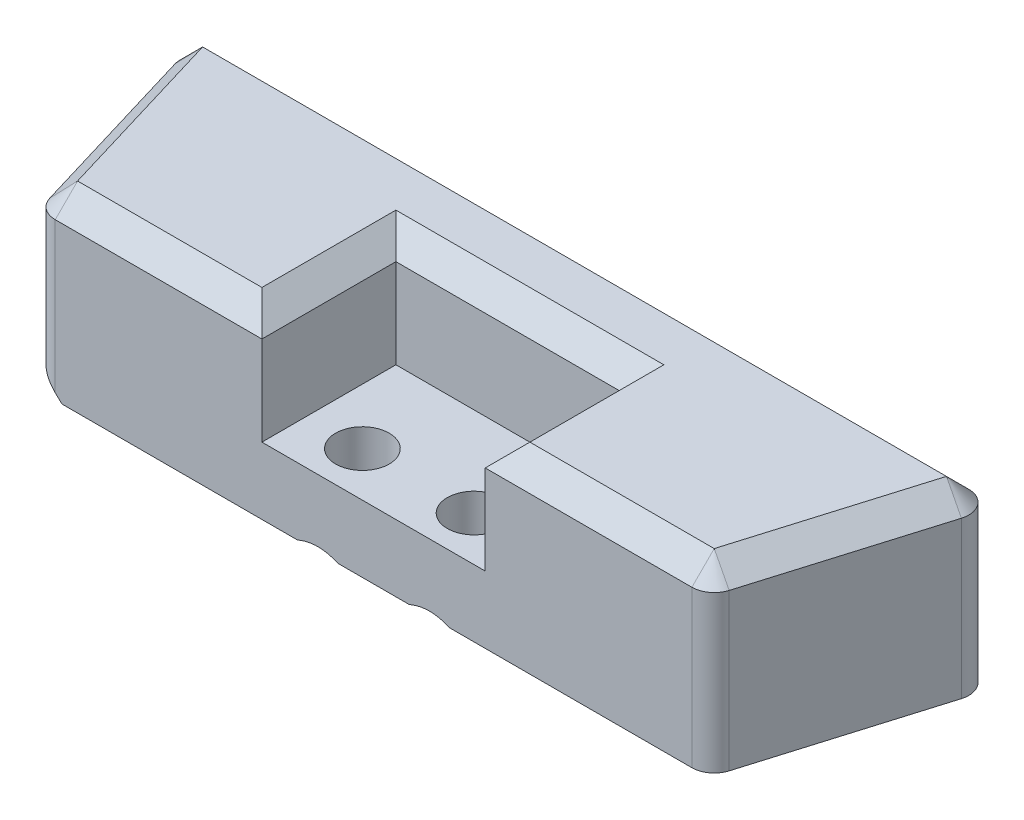
ISO-10303-21;
HEADER;
FILE_DESCRIPTION(('STEP AP214'),'2;1');
FILE_NAME('part.step','',(''),(''),'','','');
FILE_SCHEMA(('AUTOMOTIVE_DESIGN { 1 0 10303 214 1 1 1 1 }'));
ENDSEC;
DATA;
#1=APPLICATION_CONTEXT('core data for automotive mechanical design processes');
#2=APPLICATION_PROTOCOL_DEFINITION('international standard','automotive_design',2000,#1);
#3=PRODUCT_CONTEXT('',#1,'mechanical');
#4=PRODUCT('Part','Part','',(#3));
#5=PRODUCT_RELATED_PRODUCT_CATEGORY('part','',(#4));
#6=PRODUCT_DEFINITION_FORMATION('','',#4);
#7=PRODUCT_DEFINITION_CONTEXT('part definition',#1,'design');
#8=PRODUCT_DEFINITION('design','',#6,#7);
#9=PRODUCT_DEFINITION_SHAPE('','',#8);
#10=(LENGTH_UNIT() NAMED_UNIT(*) SI_UNIT(.MILLI.,.METRE.));
#11=(NAMED_UNIT(*) PLANE_ANGLE_UNIT() SI_UNIT($,.RADIAN.));
#12=(NAMED_UNIT(*) SI_UNIT($,.STERADIAN.) SOLID_ANGLE_UNIT());
#13=UNCERTAINTY_MEASURE_WITH_UNIT(LENGTH_MEASURE(1.E-05),#10,'distance_accuracy_value','');
#14=(GEOMETRIC_REPRESENTATION_CONTEXT(3) GLOBAL_UNCERTAINTY_ASSIGNED_CONTEXT((#13)) GLOBAL_UNIT_ASSIGNED_CONTEXT((#10,
#11,#12)) REPRESENTATION_CONTEXT('',''));
#15=CARTESIAN_POINT('',(0.,0.,0.));
#16=DIRECTION('',(0.,0.,1.));
#17=DIRECTION('',(1.,0.,0.));
#18=AXIS2_PLACEMENT_3D('',#15,#16,#17);
#19=CARTESIAN_POINT('',(31.6559693491089,0.,-9.));
#20=DIRECTION('',(0.,1.,0.));
#21=DIRECTION('',(0.,0.,1.));
#22=AXIS2_PLACEMENT_3D('',#19,#20,#21);
#23=PLANE('',#22);
#24=DIRECTION('',(1.,0.,0.));
#25=VECTOR('',#24,1.);
#26=CARTESIAN_POINT('',(29.2559693491089,0.,0.));
#27=LINE('',#26,#25);
#28=CARTESIAN_POINT('',(1.04403065089105,0.,0.));
#29=VERTEX_POINT('',#28);
#30=CARTESIAN_POINT('',(11.5834848610088,0.,0.));
#31=VERTEX_POINT('',#30);
#32=EDGE_CURVE('E202',#29,#31,#27,.T.);
#33=ORIENTED_EDGE('',*,*,#32,.F.);
#34=DIRECTION('',(-0.287347885566345,0.,-0.957826285221152));
#35=VECTOR('',#34,1.);
#36=CARTESIAN_POINT('',(1.09455769936776,0.,0.168423494922357));
#37=LINE('',#36,#35);
#38=CARTESIAN_POINT('',(-1.94331723467529,0.,-9.95782628522115));
#39=VERTEX_POINT('',#38);
#40=EDGE_CURVE('E11',#29,#39,#37,.T.);
#41=ORIENTED_EDGE('',*,*,#40,.T.);
#42=CARTESIAN_POINT('',(-1.65596934910894,0.,-9.));
#43=DIRECTION('',(0.,1.,0.));
#44=DIRECTION('',(0.,0.,-1.));
#45=AXIS2_PLACEMENT_3D('',#42,#43,#44);
#46=CIRCLE('',#45,1.);
#47=CARTESIAN_POINT('',(-1.65596934910894,0.,-10.));
#48=VERTEX_POINT('',#47);
#49=EDGE_CURVE('E207',#48,#39,#46,.T.);
#50=ORIENTED_EDGE('',*,*,#49,.F.);
#51=DIRECTION('',(-1.,0.,0.));
#52=VECTOR('',#51,1.);
#53=CARTESIAN_POINT('',(-1.65596934910894,0.,-10.));
#54=LINE('',#53,#52);
#55=CARTESIAN_POINT('',(31.6559693491089,0.,-10.));
#56=VERTEX_POINT('',#55);
#57=EDGE_CURVE('E440',#56,#48,#54,.T.);
#58=ORIENTED_EDGE('',*,*,#57,.F.);
#59=CARTESIAN_POINT('',(31.6559693491089,0.,-9.));
#60=DIRECTION('',(0.,1.,0.));
#61=DIRECTION('',(0.,0.,1.));
#62=AXIS2_PLACEMENT_3D('',#59,#60,#61);
#63=CIRCLE('',#62,1.);
#64=CARTESIAN_POINT('',(32.6137956343301,0.,-8.71265211443365));
#65=VERTEX_POINT('',#64);
#66=EDGE_CURVE('E438',#65,#56,#63,.T.);
#67=ORIENTED_EDGE('',*,*,#66,.F.);
#68=DIRECTION('',(0.287347885566346,0.,-0.957826285221151));
#69=VECTOR('',#68,1.);
#70=CARTESIAN_POINT('',(32.6137956343301,0.,-8.71265211443365));
#71=LINE('',#70,#69);
#72=CARTESIAN_POINT('',(30.2137956343301,0.,-0.712652114433649));
#73=VERTEX_POINT('',#72);
#74=EDGE_CURVE('E214',#73,#65,#71,.T.);
#75=ORIENTED_EDGE('',*,*,#74,.F.);
#76=CARTESIAN_POINT('',(29.2559693491089,0.,-0.999999999999996));
#77=DIRECTION('',(0.,1.,0.));
#78=DIRECTION('',(0.,0.,-1.));
#79=AXIS2_PLACEMENT_3D('',#76,#77,#78);
#80=CIRCLE('',#79,1.);
#81=CARTESIAN_POINT('',(29.2559693491089,0.,0.));
#82=VERTEX_POINT('',#81);
#83=EDGE_CURVE('E206',#82,#73,#80,.T.);
#84=ORIENTED_EDGE('',*,*,#83,.F.);
#85=CARTESIAN_POINT('',(18.4165151389912,0.,0.));
#86=VERTEX_POINT('',#85);
#87=EDGE_CURVE('E193',#86,#82,#27,.T.);
#88=ORIENTED_EDGE('',*,*,#87,.F.);
#89=CARTESIAN_POINT('',(17.5,0.,-2.));
#90=DIRECTION('',(0.,-1.,0.));
#91=DIRECTION('',(0.,0.,-1.));
#92=AXIS2_PLACEMENT_3D('',#89,#90,#91);
#93=CIRCLE('',#92,2.2);
#94=CARTESIAN_POINT('',(16.5834848610088,0.,0.));
#95=VERTEX_POINT('',#94);
#96=EDGE_CURVE('E178',#95,#86,#93,.T.);
#97=ORIENTED_EDGE('',*,*,#96,.F.);
#98=CARTESIAN_POINT('',(13.4165151389912,0.,0.));
#99=VERTEX_POINT('',#98);
#100=EDGE_CURVE('E191',#99,#95,#27,.T.);
#101=ORIENTED_EDGE('',*,*,#100,.F.);
#102=CARTESIAN_POINT('',(12.5,0.,-2.));
#103=DIRECTION('',(0.,-1.,0.));
#104=DIRECTION('',(0.,0.,-1.));
#105=AXIS2_PLACEMENT_3D('',#102,#103,#104);
#106=CIRCLE('',#105,2.2);
#107=EDGE_CURVE('E479',#31,#99,#106,.T.);
#108=ORIENTED_EDGE('',*,*,#107,.F.);
#109=EDGE_LOOP('',(#33,#41,#50,#58,#67,#75,#84,#88,#97,#101,#108));
#110=FACE_BOUND('',#109,.T.);
#111=ADVANCED_FACE('F41',(#110),#23,.F.);
#112=CARTESIAN_POINT('',(31.6559693491089,8.,-9.));
#113=DIRECTION('',(0.,-1.,0.));
#114=DIRECTION('',(0.,0.,-1.));
#115=AXIS2_PLACEMENT_3D('',#112,#113,#114);
#116=CYLINDRICAL_SURFACE('',#115,1.);
#117=DIRECTION('',(0.,-1.,0.));
#118=VECTOR('',#117,1.);
#119=CARTESIAN_POINT('',(31.6559693491089,8.,-10.));
#120=LINE('',#119,#118);
#121=CARTESIAN_POINT('',(31.6559693491089,7.,-10.));
#122=VERTEX_POINT('',#121);
#123=EDGE_CURVE('E242',#122,#56,#120,.T.);
#124=ORIENTED_EDGE('',*,*,#123,.F.);
#125=CARTESIAN_POINT('',(31.6559693491089,7.,-9.));
#126=DIRECTION('',(0.,1.,0.));
#127=DIRECTION('',(0.,0.,1.));
#128=AXIS2_PLACEMENT_3D('',#125,#126,#127);
#129=CIRCLE('',#128,1.);
#130=CARTESIAN_POINT('',(32.6137956343301,7.,-8.71265211443365));
#131=VERTEX_POINT('',#130);
#132=EDGE_CURVE('E68',#122,#131,#129,.F.);
#133=ORIENTED_EDGE('',*,*,#132,.T.);
#134=DIRECTION('',(0.,-1.,0.));
#135=VECTOR('',#134,1.);
#136=CARTESIAN_POINT('',(32.6137956343301,8.,-8.71265211443365));
#137=LINE('',#136,#135);
#138=EDGE_CURVE('E218',#131,#65,#137,.T.);
#139=ORIENTED_EDGE('',*,*,#138,.T.);
#140=ORIENTED_EDGE('',*,*,#66,.T.);
#141=EDGE_LOOP('',(#124,#133,#139,#140));
#142=FACE_BOUND('',#141,.T.);
#143=ADVANCED_FACE('F292',(#142),#116,.T.);
#144=CARTESIAN_POINT('',(-1.65596934910894,8.,-10.));
#145=DIRECTION('',(0.,0.,1.));
#146=DIRECTION('',(1.,0.,0.));
#147=AXIS2_PLACEMENT_3D('',#144,#145,#146);
#148=PLANE('',#147);
#149=DIRECTION('',(0.,-1.,0.));
#150=VECTOR('',#149,1.);
#151=CARTESIAN_POINT('',(-1.65596934910894,8.,-10.));
#152=LINE('',#151,#150);
#153=CARTESIAN_POINT('',(-1.65596934910894,7.,-10.));
#154=VERTEX_POINT('',#153);
#155=EDGE_CURVE('E239',#154,#48,#152,.T.);
#156=ORIENTED_EDGE('',*,*,#155,.F.);
#157=DIRECTION('',(1.,0.,0.));
#158=VECTOR('',#157,1.);
#159=CARTESIAN_POINT('',(31.6559693491089,7.,-10.));
#160=LINE('',#159,#158);
#161=EDGE_CURVE('E376',#154,#122,#160,.T.);
#162=ORIENTED_EDGE('',*,*,#161,.T.);
#163=ORIENTED_EDGE('',*,*,#123,.T.);
#164=ORIENTED_EDGE('',*,*,#57,.T.);
#165=EDGE_LOOP('',(#156,#162,#163,#164));
#166=FACE_BOUND('',#165,.T.);
#167=ADVANCED_FACE('F433',(#166),#148,.F.);
#168=CARTESIAN_POINT('',(-1.65596934910894,8.,-9.));
#169=DIRECTION('',(0.,-1.,0.));
#170=DIRECTION('',(0.,0.,-1.));
#171=AXIS2_PLACEMENT_3D('',#168,#169,#170);
#172=CYLINDRICAL_SURFACE('',#171,1.);
#173=DIRECTION('',(0.,-1.,0.));
#174=VECTOR('',#173,1.);
#175=CARTESIAN_POINT('',(-2.6137956343301,8.,-8.71265211443365));
#176=LINE('',#175,#174);
#177=CARTESIAN_POINT('',(-2.6137956343301,7.,-8.71265211443365));
#178=VERTEX_POINT('',#177);
#179=CARTESIAN_POINT('',(-2.6137956343301,1.,-8.71265211443365));
#180=VERTEX_POINT('',#179);
#181=EDGE_CURVE('E235',#178,#180,#176,.T.);
#182=ORIENTED_EDGE('',*,*,#181,.F.);
#183=CARTESIAN_POINT('',(-1.65596934910894,7.,-9.));
#184=DIRECTION('',(0.,1.,0.));
#185=DIRECTION('',(0.,0.,1.));
#186=AXIS2_PLACEMENT_3D('',#183,#184,#185);
#187=CIRCLE('',#186,1.);
#188=EDGE_CURVE('E426',#178,#154,#187,.F.);
#189=ORIENTED_EDGE('',*,*,#188,.T.);
#190=ORIENTED_EDGE('',*,*,#155,.T.);
#191=ORIENTED_EDGE('',*,*,#49,.T.);
#192=CARTESIAN_POINT('',(-1.65596934910894,0.,-9.));
#193=DIRECTION('',(0.677285461478598,0.707106781186546,-0.203185638443579));
#194=DIRECTION('',(0.677285461478595,-0.707106781186549,-0.203185638443578));
#195=AXIS2_PLACEMENT_3D('',#192,#193,#194);
#196=ELLIPSE('',#195,1.4142135623731,1.);
#197=EDGE_CURVE('E423',#39,#180,#196,.T.);
#198=ORIENTED_EDGE('',*,*,#197,.T.);
#199=EDGE_LOOP('',(#182,#189,#190,#191,#198));
#200=FACE_BOUND('',#199,.T.);
#201=ADVANCED_FACE('F673',(#200),#172,.T.);
#202=CARTESIAN_POINT('',(-0.213795634330095,8.,-0.712652114433649));
#203=DIRECTION('',(0.957826285221151,0.,-0.287347885566345));
#204=DIRECTION('',(-0.287347885566345,0.,-0.957826285221152));
#205=AXIS2_PLACEMENT_3D('',#202,#203,#204);
#206=PLANE('',#205);
#207=DIRECTION('',(0.,-1.,0.));
#208=VECTOR('',#207,1.);
#209=CARTESIAN_POINT('',(-0.213795634330093,8.,-0.71265211443365));
#210=LINE('',#209,#208);
#211=CARTESIAN_POINT('',(-0.213795634330093,7.,-0.71265211443365));
#212=VERTEX_POINT('',#211);
#213=CARTESIAN_POINT('',(-0.213795634330093,1.,-0.71265211443365));
#214=VERTEX_POINT('',#213);
#215=EDGE_CURVE('E231',#212,#214,#210,.T.);
#216=ORIENTED_EDGE('',*,*,#215,.F.);
#217=DIRECTION('',(-0.287347885566345,0.,-0.957826285221152));
#218=VECTOR('',#217,1.);
#219=CARTESIAN_POINT('',(-2.6137956343301,7.,-8.71265211443365));
#220=LINE('',#219,#218);
#221=EDGE_CURVE('E420',#212,#178,#220,.T.);
#222=ORIENTED_EDGE('',*,*,#221,.T.);
#223=ORIENTED_EDGE('',*,*,#181,.T.);
#224=DIRECTION('',(0.287347885566345,0.,0.957826285221152));
#225=VECTOR('',#224,1.);
#226=CARTESIAN_POINT('',(-0.213795634330095,1.,-0.712652114433649));
#227=LINE('',#226,#225);
#228=EDGE_CURVE('E416',#180,#214,#227,.T.);
#229=ORIENTED_EDGE('',*,*,#228,.T.);
#230=EDGE_LOOP('',(#216,#222,#223,#229));
#231=FACE_BOUND('',#230,.T.);
#232=ADVANCED_FACE('F664',(#231),#206,.F.);
#233=CARTESIAN_POINT('',(0.744030650891059,8.,-0.999999999999996));
#234=DIRECTION('',(0.,-1.,0.));
#235=DIRECTION('',(0.,0.,-1.));
#236=AXIS2_PLACEMENT_3D('',#233,#234,#235);
#237=CYLINDRICAL_SURFACE('',#236,1.);
#238=DIRECTION('',(0.,-1.,0.));
#239=VECTOR('',#238,1.);
#240=CARTESIAN_POINT('',(0.744030650891059,8.,0.));
#241=LINE('',#240,#239);
#242=CARTESIAN_POINT('',(0.744030650891059,7.,0.));
#243=VERTEX_POINT('',#242);
#244=CARTESIAN_POINT('',(0.744030650891059,0.287347885566343,0.));
#245=VERTEX_POINT('',#244);
#246=EDGE_CURVE('E227',#243,#245,#241,.T.);
#247=ORIENTED_EDGE('',*,*,#246,.F.);
#248=CARTESIAN_POINT('',(0.744030650891059,7.,-0.999999999999996));
#249=DIRECTION('',(0.,1.,0.));
#250=DIRECTION('',(0.,0.,1.));
#251=AXIS2_PLACEMENT_3D('',#248,#249,#250);
#252=CIRCLE('',#251,1.);
#253=EDGE_CURVE('E413',#243,#212,#252,.F.);
#254=ORIENTED_EDGE('',*,*,#253,.T.);
#255=ORIENTED_EDGE('',*,*,#215,.T.);
#256=CARTESIAN_POINT('',(0.744030650891059,0.,-0.999999999999996));
#257=DIRECTION('',(0.677285461478598,0.707106781186546,-0.203185638443579));
#258=DIRECTION('',(0.677285461478595,-0.707106781186549,-0.203185638443578));
#259=AXIS2_PLACEMENT_3D('',#256,#257,#258);
#260=ELLIPSE('',#259,1.4142135623731,1.);
#261=EDGE_CURVE('E410',#214,#245,#260,.T.);
#262=ORIENTED_EDGE('',*,*,#261,.T.);
#263=EDGE_LOOP('',(#247,#254,#255,#262));
#264=FACE_BOUND('',#263,.T.);
#265=ADVANCED_FACE('F300',(#264),#237,.T.);
#266=CARTESIAN_POINT('',(29.2559693491089,8.,0.));
#267=DIRECTION('',(0.,0.,-1.));
#268=DIRECTION('',(-1.,0.,0.));
#269=AXIS2_PLACEMENT_3D('',#266,#267,#268);
#270=PLANE('',#269);
#271=DIRECTION('',(0.,1.,0.));
#272=VECTOR('',#271,1.);
#273=CARTESIAN_POINT('',(10.,3.,0.));
#274=LINE('',#273,#272);
#275=CARTESIAN_POINT('',(10.,3.,0.));
#276=VERTEX_POINT('',#275);
#277=CARTESIAN_POINT('',(10.,7.,0.));
#278=VERTEX_POINT('',#277);
#279=EDGE_CURVE('E446',#276,#278,#274,.T.);
#280=ORIENTED_EDGE('',*,*,#279,.T.);
#281=DIRECTION('',(-1.,0.,0.));
#282=VECTOR('',#281,1.);
#283=CARTESIAN_POINT('',(0.744030650891059,7.,0.));
#284=LINE('',#283,#282);
#285=EDGE_CURVE('E407',#278,#243,#284,.T.);
#286=ORIENTED_EDGE('',*,*,#285,.T.);
#287=ORIENTED_EDGE('',*,*,#246,.T.);
#288=DIRECTION('',(-0.722171101940853,0.691714463866077,0.));
#289=VECTOR('',#288,1.);
#290=CARTESIAN_POINT('',(-0.111501072449666,1.10679865802264,0.));
#291=LINE('',#290,#289);
#292=EDGE_CURVE('E401',#245,#29,#291,.F.);
#293=ORIENTED_EDGE('',*,*,#292,.T.);
#294=ORIENTED_EDGE('',*,*,#32,.T.);
#295=CARTESIAN_POINT('',(4.86476291483925,-5.69283506394337,0.));
#296=CARTESIAN_POINT('',(5.06483156008779,-5.49931389069071,0.));
#297=CARTESIAN_POINT('',(5.2651278676822,-5.30602692406609,0.));
#298=CARTESIAN_POINT('',(5.66635598220347,-4.92008488495991,0.));
#299=CARTESIAN_POINT('',(5.86728783392975,-4.72742985906571,0.));
#300=CARTESIAN_POINT('',(6.27058798331678,-4.34232286813453,0.));
#301=CARTESIAN_POINT('',(6.47295882391733,-4.14987356395647,0.));
#302=CARTESIAN_POINT('',(6.87873583359035,-3.76609238886207,0.));
#303=CARTESIAN_POINT('',(7.08214194060438,-3.57476045240846,0.));
#304=CARTESIAN_POINT('',(7.51597094058319,-3.16970757208654,0.));
#305=CARTESIAN_POINT('',(7.74658249828246,-2.95618846173251,0.));
#306=CARTESIAN_POINT('',(8.21045698010778,-2.53194255225312,0.));
#307=CARTESIAN_POINT('',(8.44372041283256,-2.32121630614188,0.));
#308=CARTESIAN_POINT('',(8.79643588639768,-2.0087372185661,0.));
#309=CARTESIAN_POINT('',(8.91436919607464,-1.90527172848045,0.));
#310=CARTESIAN_POINT('',(9.15152972835939,-1.69983649855112,0.));
#311=CARTESIAN_POINT('',(9.2707569181672,-1.59786672094438,0.));
#312=CARTESIAN_POINT('',(9.51084632722986,-1.39594543497909,0.));
#313=CARTESIAN_POINT('',(9.63170800789745,-1.29599328760042,0.));
#314=CARTESIAN_POINT('',(9.87562670452653,-1.09881148973559,0.));
#315=CARTESIAN_POINT('',(9.99868348156483,-1.0015815458783,0.));
#316=CARTESIAN_POINT('',(10.1864866013312,-0.857891395573313,0.));
#317=CARTESIAN_POINT('',(10.2501305969218,-0.809990826083948,0.));
#318=CARTESIAN_POINT('',(10.3783258971975,-0.715411491229874,0.));
#319=CARTESIAN_POINT('',(10.4428772319505,-0.668732766502892,0.));
#320=CARTESIAN_POINT('',(10.5731304383526,-0.576813697694099,0.));
#321=CARTESIAN_POINT('',(10.6388337518691,-0.531575390579714,0.));
#322=CARTESIAN_POINT('',(10.7714932035222,-0.442971340706097,0.));
#323=CARTESIAN_POINT('',(10.8384492991346,-0.399605534551707,0.));
#324=CARTESIAN_POINT('',(10.9727819652312,-0.31588519380588,0.));
#325=CARTESIAN_POINT('',(11.0401357455001,-0.275494278981927,0.));
#326=CARTESIAN_POINT('',(11.1765214278914,-0.197594812064875,0.));
#327=CARTESIAN_POINT('',(11.2455536905302,-0.160086886529309,0.));
#328=CARTESIAN_POINT('',(11.3853587135647,-0.0888458963693163,0.));
#329=CARTESIAN_POINT('',(11.4561271787051,-0.0551044760806418,0.));
#330=CARTESIAN_POINT('',(11.5997189481647,0.00766315787844078,0.));
#331=CARTESIAN_POINT('',(11.6725413385773,0.0366914310238443,0.));
#332=CARTESIAN_POINT('',(11.8085892450533,0.0846589139742424,0.));
#333=CARTESIAN_POINT('',(11.8715054294678,0.104468048663704,0.));
#334=CARTESIAN_POINT('',(11.9987256696359,0.139045722835718,0.));
#335=CARTESIAN_POINT('',(12.0630296450817,0.153814553160388,0.));
#336=CARTESIAN_POINT('',(12.1923283002325,0.177464321810971,0.));
#337=CARTESIAN_POINT('',(12.2573164827631,0.186380204048787,0.));
#338=CARTESIAN_POINT('',(12.3878542114162,0.197912655801655,0.));
#339=CARTESIAN_POINT('',(12.4534037001183,0.200529862112938,0.));
#340=CARTESIAN_POINT('',(12.5825852789833,0.199308657119851,0.));
#341=CARTESIAN_POINT('',(12.646219174638,0.195650699170583,0.));
#342=CARTESIAN_POINT('',(12.7728673904044,0.182455027150612,0.));
#343=CARTESIAN_POINT('',(12.8358816736466,0.172916965315642,0.));
#344=CARTESIAN_POINT('',(12.9612196322542,0.148434936563577,0.));
#345=CARTESIAN_POINT('',(13.0235370803406,0.133459557738823,0.));
#346=CARTESIAN_POINT('',(13.1468433403127,0.0988323996755783,0.));
#347=CARTESIAN_POINT('',(13.2078320278459,0.0791801847881716,0.));
#348=CARTESIAN_POINT('',(13.4024312881065,0.00942467698355255,0.));
#349=CARTESIAN_POINT('',(13.5332548417008,-0.0484380692392189,0.));
#350=CARTESIAN_POINT('',(13.7886662231976,-0.176636767416517,0.));
#351=CARTESIAN_POINT('',(13.9132407638782,-0.246997963505585,0.));
#352=CARTESIAN_POINT('',(14.0972115727243,-0.359045398471667,0.));
#353=CARTESIAN_POINT('',(14.158451861589,-0.397759301832768,0.));
#354=CARTESIAN_POINT('',(14.2798329643976,-0.476878367571731,0.));
#355=CARTESIAN_POINT('',(14.3399737493151,-0.517283574506625,0.));
#356=CARTESIAN_POINT('',(14.4592448104214,-0.599423927159213,0.));
#357=CARTESIAN_POINT('',(14.5183760627961,-0.641157661504325,0.));
#358=CARTESIAN_POINT('',(14.6358165560259,-0.725758005507754,0.));
#359=CARTESIAN_POINT('',(14.6941258334623,-0.768624564504902,0.));
#360=CARTESIAN_POINT('',(14.9039945902283,-0.925531406500417,0.));
#361=CARTESIAN_POINT('',(15.0535049059232,-1.04231210644609,0.));
#362=CARTESIAN_POINT('',(15.3492211480079,-1.27999767638162,0.));
#363=CARTESIAN_POINT('',(15.495426377362,-1.4009034030859,0.));
#364=CARTESIAN_POINT('',(15.7855350643649,-1.64560427753442,0.));
#365=CARTESIAN_POINT('',(15.9294371642135,-1.76940103105822,0.));
#366=CARTESIAN_POINT('',(16.2154893221455,-2.01900384987638,0.));
#367=CARTESIAN_POINT('',(16.357639327127,-2.14480997580619,0.));
#368=CARTESIAN_POINT('',(16.6409640983154,-2.39821282103143,0.));
#369=CARTESIAN_POINT('',(16.7821355923575,-2.52581319283002,0.));
#370=CARTESIAN_POINT('',(17.0634524464464,-2.78214373706589,0.));
#371=CARTESIAN_POINT('',(17.2035977867158,-2.91087393117391,0.));
#372=CARTESIAN_POINT('',(17.6227337346915,-3.2982663138596,0.));
#373=CARTESIAN_POINT('',(17.9005271685959,-3.55822307618649,0.));
#374=CARTESIAN_POINT('',(18.4175721117689,-4.04590936836975,0.));
#375=CARTESIAN_POINT('',(18.6570776963891,-4.27337053602652,0.));
#376=CARTESIAN_POINT('',(19.1349864438746,-4.72949874489976,0.));
#377=CARTESIAN_POINT('',(19.3733894864143,-4.95816591216365,0.));
#378=CARTESIAN_POINT('',(19.8483417632199,-5.41537935388557,0.));
#379=CARTESIAN_POINT('',(20.0848945618199,-5.64392192986523,0.));
#380=CARTESIAN_POINT('',(20.5573311883227,-6.10164174523856,0.));
#381=CARTESIAN_POINT('',(20.7932150921513,-6.33081890624409,0.));
#382=CARTESIAN_POINT('',(21.0288703478945,-6.56022998620436,0.));
#383=B_SPLINE_CURVE_WITH_KNOTS('',3,(#295,#296,#297,#298,#299,#300,#301,#302,#303,#304,#305,
#306,#307,#308,#309,#310,#311,#312,#313,#314,#315,#316,#317,#318,#319,#320,#321,#322,#323,#324,
#325,#326,#327,#328,#329,#330,#331,#332,#333,#334,#335,#336,#337,#338,#339,#340,#341,#342,#343,
#344,#345,#346,#347,#348,#349,#350,#351,#352,#353,#354,#355,#356,#357,#358,#359,#360,#361,#362,
#363,#364,#365,#366,#367,#368,#369,#370,#371,#372,#373,#374,#375,#376,#377,#378,#379,#380,#381,
#382),.UNSPECIFIED.,.F.,.F.,(4,2,2,2,2,2,2,2,2,2,2,2,2,2,2,2,2,2,2,2,2,2,2,2,2,2,2,2,2,2,2,2,2,
2,2,2,2,2,2,2,2,2,2,4),(0.,0.835046631980321,1.67015349993751,2.50795488987716,3.34570663629257,
4.28853502097159,5.2315473864868,5.70219798933241,6.17283668888224,6.64332391265446,
7.11376023543612,7.35271592343198,7.59167954885938,7.83096731484305,8.07024697316776,
8.30579993983057,8.54140395511146,8.77647445615357,9.01144196182128,9.20915015779482,
9.40684694342634,9.60335241617479,9.79983802138228,9.99076758617129,10.1817084441027,
10.3737704096945,10.5658502729332,10.9937960663164,11.422616253871,11.6399451884834,
11.8572798521881,12.074390865776,12.2914921862959,12.8604963718106,13.4296194602086,
13.999066554104,14.5685308644027,15.1394004212179,15.7102809517186,16.8516264074713,
17.8425381259494,18.8335555492914,19.8203168302155,20.8069612211134),.UNSPECIFIED.);
#384=EDGE_CURVE('E185',#31,#99,#383,.T.);
#385=ORIENTED_EDGE('',*,*,#384,.T.);
#386=ORIENTED_EDGE('',*,*,#100,.T.);
#387=CARTESIAN_POINT('',(9.86476291483928,-5.69283506394335,0.));
#388=CARTESIAN_POINT('',(10.0648315600878,-5.4993138906907,0.));
#389=CARTESIAN_POINT('',(10.2651278676822,-5.30602692406607,0.));
#390=CARTESIAN_POINT('',(10.6663559822035,-4.92008488495989,0.));
#391=CARTESIAN_POINT('',(10.8672878339298,-4.7274298590657,0.));
#392=CARTESIAN_POINT('',(11.2705879833168,-4.34232286813451,0.));
#393=CARTESIAN_POINT('',(11.4729588239174,-4.14987356395646,0.));
#394=CARTESIAN_POINT('',(11.8787358335904,-3.76609238886206,0.));
#395=CARTESIAN_POINT('',(12.0821419406044,-3.57476045240845,0.));
#396=CARTESIAN_POINT('',(12.5159709405832,-3.16970757208653,0.));
#397=CARTESIAN_POINT('',(12.7465824982825,-2.9561884617325,0.));
#398=CARTESIAN_POINT('',(13.2104569801078,-2.53194255225312,0.));
#399=CARTESIAN_POINT('',(13.4437204128326,-2.32121630614187,0.));
#400=CARTESIAN_POINT('',(13.7964358863977,-2.00873721856609,0.));
#401=CARTESIAN_POINT('',(13.9143691960746,-1.90527172848045,0.));
#402=CARTESIAN_POINT('',(14.1515297283594,-1.69983649855112,0.));
#403=CARTESIAN_POINT('',(14.2707569181672,-1.59786672094437,0.));
#404=CARTESIAN_POINT('',(14.5108463272299,-1.39594543497909,0.));
#405=CARTESIAN_POINT('',(14.6317080078975,-1.29599328760042,0.));
#406=CARTESIAN_POINT('',(14.8756267045265,-1.09881148973558,0.));
#407=CARTESIAN_POINT('',(14.9986834815648,-1.00158154587829,0.));
#408=CARTESIAN_POINT('',(15.1864866013312,-0.857891395573312,0.));
#409=CARTESIAN_POINT('',(15.2501305969218,-0.809990826083948,0.));
#410=CARTESIAN_POINT('',(15.3783258971975,-0.715411491229874,0.));
#411=CARTESIAN_POINT('',(15.4428772319505,-0.668732766502892,0.));
#412=CARTESIAN_POINT('',(15.5731304383526,-0.576813697694099,0.));
#413=CARTESIAN_POINT('',(15.6388337518691,-0.531575390579713,0.));
#414=CARTESIAN_POINT('',(15.7714932035222,-0.442971340706096,0.));
#415=CARTESIAN_POINT('',(15.8384492991346,-0.399605534551705,0.));
#416=CARTESIAN_POINT('',(15.9727819652312,-0.315885193805879,0.));
#417=CARTESIAN_POINT('',(16.0401357455001,-0.275494278981925,0.));
#418=CARTESIAN_POINT('',(16.1765214278914,-0.197594812064873,0.));
#419=CARTESIAN_POINT('',(16.2455536905302,-0.160086886529308,0.));
#420=CARTESIAN_POINT('',(16.3853587135648,-0.0888458963693149,0.));
#421=CARTESIAN_POINT('',(16.4561271787051,-0.0551044760806404,0.));
#422=CARTESIAN_POINT('',(16.5997189481647,0.00766315787844292,0.));
#423=CARTESIAN_POINT('',(16.6725413385773,0.0366914310238471,0.));
#424=CARTESIAN_POINT('',(16.8085892450533,0.084658913974245,0.));
#425=CARTESIAN_POINT('',(16.8715054294678,0.104468048663706,0.));
#426=CARTESIAN_POINT('',(16.9987256696359,0.13904572283572,0.));
#427=CARTESIAN_POINT('',(17.0630296450817,0.15381455316039,0.));
#428=CARTESIAN_POINT('',(17.1923283002325,0.177464321810973,0.));
#429=CARTESIAN_POINT('',(17.2573164827631,0.186380204048788,0.));
#430=CARTESIAN_POINT('',(17.3878542114162,0.197912655801657,0.));
#431=CARTESIAN_POINT('',(17.4534037001183,0.20052986211294,0.));
#432=CARTESIAN_POINT('',(17.5825852789833,0.199308657119852,0.));
#433=CARTESIAN_POINT('',(17.646219174638,0.195650699170585,0.));
#434=CARTESIAN_POINT('',(17.7728673904044,0.182455027150614,0.));
#435=CARTESIAN_POINT('',(17.8358816736466,0.172916965315645,0.));
#436=CARTESIAN_POINT('',(17.9612196322542,0.148434936563581,0.));
#437=CARTESIAN_POINT('',(18.0235370803406,0.133459557738827,0.));
#438=CARTESIAN_POINT('',(18.1468433403127,0.0988323996755825,0.));
#439=CARTESIAN_POINT('',(18.2078320278459,0.0791801847881754,0.));
#440=CARTESIAN_POINT('',(18.4024312881065,0.0094246769835565,0.));
#441=CARTESIAN_POINT('',(18.5332548417008,-0.0484380692392138,0.));
#442=CARTESIAN_POINT('',(18.7886662231976,-0.17663676741651,0.));
#443=CARTESIAN_POINT('',(18.9132407638781,-0.246997963505576,0.));
#444=CARTESIAN_POINT('',(19.0972115727242,-0.359045398471657,0.));
#445=CARTESIAN_POINT('',(19.158451861589,-0.397759301832758,0.));
#446=CARTESIAN_POINT('',(19.2798329643976,-0.47687836757172,0.));
#447=CARTESIAN_POINT('',(19.3399737493151,-0.517283574506613,0.));
#448=CARTESIAN_POINT('',(19.4592448104214,-0.599423927159199,0.));
#449=CARTESIAN_POINT('',(19.5183760627961,-0.641157661504309,0.));
#450=CARTESIAN_POINT('',(19.6358165560258,-0.725758005507735,0.));
#451=CARTESIAN_POINT('',(19.6941258334622,-0.768624564504882,0.));
#452=CARTESIAN_POINT('',(19.9039945902283,-0.925531406500396,0.));
#453=CARTESIAN_POINT('',(20.0535049059232,-1.04231210644607,0.));
#454=CARTESIAN_POINT('',(20.3492211480079,-1.2799976763816,0.));
#455=CARTESIAN_POINT('',(20.495426377362,-1.40090340308588,0.));
#456=CARTESIAN_POINT('',(20.7855350643649,-1.6456042775344,0.));
#457=CARTESIAN_POINT('',(20.9294371642135,-1.7694010310582,0.));
#458=CARTESIAN_POINT('',(21.2154893221455,-2.01900384987635,0.));
#459=CARTESIAN_POINT('',(21.357639327127,-2.14480997580617,0.));
#460=CARTESIAN_POINT('',(21.6409640983154,-2.39821282103141,0.));
#461=CARTESIAN_POINT('',(21.7821355923575,-2.52581319283,0.));
#462=CARTESIAN_POINT('',(22.0634524464463,-2.78214373706587,0.));
#463=CARTESIAN_POINT('',(22.2035977867158,-2.91087393117389,0.));
#464=CARTESIAN_POINT('',(22.6227337346915,-3.29826631385958,0.));
#465=CARTESIAN_POINT('',(22.9005271685958,-3.55822307618647,0.));
#466=CARTESIAN_POINT('',(23.4175721117689,-4.04590936836973,0.));
#467=CARTESIAN_POINT('',(23.6570776963891,-4.2733705360265,0.));
#468=CARTESIAN_POINT('',(24.1349864438746,-4.72949874489975,0.));
#469=CARTESIAN_POINT('',(24.3733894864142,-4.95816591216364,0.));
#470=CARTESIAN_POINT('',(24.8483417632199,-5.41537935388555,0.));
#471=CARTESIAN_POINT('',(25.0848945618199,-5.64392192986522,0.));
#472=CARTESIAN_POINT('',(25.5573311883227,-6.10164174523854,0.));
#473=CARTESIAN_POINT('',(25.7932150921512,-6.33081890624408,0.));
#474=CARTESIAN_POINT('',(26.0288703478945,-6.56022998620434,0.));
#475=B_SPLINE_CURVE_WITH_KNOTS('',3,(#387,#388,#389,#390,#391,#392,#393,#394,#395,#396,#397,
#398,#399,#400,#401,#402,#403,#404,#405,#406,#407,#408,#409,#410,#411,#412,#413,#414,#415,#416,
#417,#418,#419,#420,#421,#422,#423,#424,#425,#426,#427,#428,#429,#430,#431,#432,#433,#434,#435,
#436,#437,#438,#439,#440,#441,#442,#443,#444,#445,#446,#447,#448,#449,#450,#451,#452,#453,#454,
#455,#456,#457,#458,#459,#460,#461,#462,#463,#464,#465,#466,#467,#468,#469,#470,#471,#472,#473,
#474),.UNSPECIFIED.,.F.,.F.,(4,2,2,2,2,2,2,2,2,2,2,2,2,2,2,2,2,2,2,2,2,2,2,2,2,2,2,2,2,2,2,2,2,
2,2,2,2,2,2,2,2,2,2,4),(0.,0.835046631980316,1.6701534999375,2.50795488987714,3.34570663629256,
4.28853502097158,5.23154738648678,5.70219798933238,6.17283668888221,6.64332391265443,
7.11376023543609,7.35271592343195,7.59167954885935,7.83096731484302,8.07024697316773,
8.30579993983053,8.54140395511143,8.77647445615354,9.01144196182124,9.20915015779479,
9.40684694342631,9.60335241617476,9.79983802138224,9.99076758617125,10.1817084441027,
10.3737704096945,10.5658502729332,10.9937960663164,11.4226162538709,11.6399451884833,
11.857279852188,12.074390865776,12.2914921862958,12.8604963718105,13.4296194602085,
13.9990665541039,14.5685308644026,15.1394004212178,15.7102809517185,16.8516264074712,
17.8425381259493,18.8335555492913,19.8203168302155,20.8069612211134),.UNSPECIFIED.);
#476=EDGE_CURVE('E175',#95,#86,#475,.T.);
#477=ORIENTED_EDGE('',*,*,#476,.T.);
#478=ORIENTED_EDGE('',*,*,#87,.T.);
#479=DIRECTION('',(0.,-1.,0.));
#480=VECTOR('',#479,1.);
#481=CARTESIAN_POINT('',(29.2559693491089,8.,0.));
#482=LINE('',#481,#480);
#483=CARTESIAN_POINT('',(29.2559693491089,7.,0.));
#484=VERTEX_POINT('',#483);
#485=EDGE_CURVE('E224',#484,#82,#482,.T.);
#486=ORIENTED_EDGE('',*,*,#485,.F.);
#487=DIRECTION('',(-1.,0.,0.));
#488=VECTOR('',#487,1.);
#489=CARTESIAN_POINT('',(20.,7.,0.));
#490=LINE('',#489,#488);
#491=CARTESIAN_POINT('',(20.,7.,0.));
#492=VERTEX_POINT('',#491);
#493=EDGE_CURVE('E404',#484,#492,#490,.T.);
#494=ORIENTED_EDGE('',*,*,#493,.T.);
#495=DIRECTION('',(0.,1.,0.));
#496=VECTOR('',#495,1.);
#497=CARTESIAN_POINT('',(20.,3.,0.));
#498=LINE('',#497,#496);
#499=CARTESIAN_POINT('',(20.,3.,0.));
#500=VERTEX_POINT('',#499);
#501=EDGE_CURVE('E441',#500,#492,#498,.T.);
#502=ORIENTED_EDGE('',*,*,#501,.F.);
#503=DIRECTION('',(1.,0.,0.));
#504=VECTOR('',#503,1.);
#505=CARTESIAN_POINT('',(10.,3.,0.));
#506=LINE('',#505,#504);
#507=EDGE_CURVE('E454',#276,#500,#506,.T.);
#508=ORIENTED_EDGE('',*,*,#507,.F.);
#509=EDGE_LOOP('',(#280,#286,#287,#293,#294,#385,#386,#477,#478,#486,#494,#502,#508));
#510=FACE_BOUND('',#509,.T.);
#511=ADVANCED_FACE('F199',(#510),#270,.F.);
#512=CARTESIAN_POINT('',(29.2559693491089,8.,-0.999999999999996));
#513=DIRECTION('',(0.,-1.,0.));
#514=DIRECTION('',(0.,0.,-1.));
#515=AXIS2_PLACEMENT_3D('',#512,#513,#514);
#516=CYLINDRICAL_SURFACE('',#515,1.);
#517=DIRECTION('',(0.,-1.,0.));
#518=VECTOR('',#517,1.);
#519=CARTESIAN_POINT('',(30.2137956343301,8.,-0.712652114433649));
#520=LINE('',#519,#518);
#521=CARTESIAN_POINT('',(30.2137956343301,7.,-0.712652114433649));
#522=VERTEX_POINT('',#521);
#523=EDGE_CURVE('E221',#522,#73,#520,.T.);
#524=ORIENTED_EDGE('',*,*,#523,.F.);
#525=CARTESIAN_POINT('',(29.2559693491089,7.,-0.999999999999996));
#526=DIRECTION('',(0.,1.,0.));
#527=DIRECTION('',(0.,0.,1.));
#528=AXIS2_PLACEMENT_3D('',#525,#526,#527);
#529=CIRCLE('',#528,1.);
#530=EDGE_CURVE('E303',#522,#484,#529,.F.);
#531=ORIENTED_EDGE('',*,*,#530,.T.);
#532=ORIENTED_EDGE('',*,*,#485,.T.);
#533=ORIENTED_EDGE('',*,*,#83,.T.);
#534=EDGE_LOOP('',(#524,#531,#532,#533));
#535=FACE_BOUND('',#534,.T.);
#536=ADVANCED_FACE('F294',(#535),#516,.T.);
#537=CARTESIAN_POINT('',(32.6137956343301,8.,-8.71265211443365));
#538=DIRECTION('',(-0.957826285221151,0.,-0.287347885566346));
#539=DIRECTION('',(-0.287347885566346,0.,0.957826285221152));
#540=AXIS2_PLACEMENT_3D('',#537,#538,#539);
#541=PLANE('',#540);
#542=ORIENTED_EDGE('',*,*,#138,.F.);
#543=DIRECTION('',(-0.287347885566346,0.,0.957826285221152));
#544=VECTOR('',#543,1.);
#545=CARTESIAN_POINT('',(30.2137956343301,7.,-0.712652114433649));
#546=LINE('',#545,#544);
#547=EDGE_CURVE('E60',#131,#522,#546,.T.);
#548=ORIENTED_EDGE('',*,*,#547,.T.);
#549=ORIENTED_EDGE('',*,*,#523,.T.);
#550=ORIENTED_EDGE('',*,*,#74,.T.);
#551=EDGE_LOOP('',(#542,#548,#549,#550));
#552=FACE_BOUND('',#551,.T.);
#553=ADVANCED_FACE('F288',(#552),#541,.F.);
#554=CARTESIAN_POINT('',(31.6559693491089,8.,-9.));
#555=DIRECTION('',(0.,1.,0.));
#556=DIRECTION('',(0.,0.,1.));
#557=AXIS2_PLACEMENT_3D('',#554,#555,#556);
#558=PLANE('',#557);
#559=DIRECTION('',(0.,0.,-1.));
#560=VECTOR('',#559,1.);
#561=CARTESIAN_POINT('',(8.99999999999999,8.,-6.));
#562=LINE('',#561,#560);
#563=CARTESIAN_POINT('',(8.99999999999999,8.,-1.));
#564=VERTEX_POINT('',#563);
#565=CARTESIAN_POINT('',(8.99999999999999,8.,-7.00000000000001));
#566=VERTEX_POINT('',#565);
#567=EDGE_CURVE('E391',#564,#566,#562,.T.);
#568=ORIENTED_EDGE('',*,*,#567,.T.);
#569=DIRECTION('',(1.,0.,0.));
#570=VECTOR('',#569,1.);
#571=CARTESIAN_POINT('',(20.,8.,-7.00000000000001));
#572=LINE('',#571,#570);
#573=CARTESIAN_POINT('',(21.,8.,-7.00000000000001));
#574=VERTEX_POINT('',#573);
#575=EDGE_CURVE('E394',#566,#574,#572,.T.);
#576=ORIENTED_EDGE('',*,*,#575,.T.);
#577=DIRECTION('',(0.,0.,1.));
#578=VECTOR('',#577,1.);
#579=CARTESIAN_POINT('',(21.,8.,0.));
#580=LINE('',#579,#578);
#581=CARTESIAN_POINT('',(21.,8.,-1.));
#582=VERTEX_POINT('',#581);
#583=EDGE_CURVE('E499',#574,#582,#580,.T.);
#584=ORIENTED_EDGE('',*,*,#583,.T.);
#585=DIRECTION('',(1.,0.,0.));
#586=VECTOR('',#585,1.);
#587=CARTESIAN_POINT('',(29.2559693491089,8.,-1.));
#588=LINE('',#587,#586);
#589=CARTESIAN_POINT('',(29.2559693491089,8.,-1.));
#590=VERTEX_POINT('',#589);
#591=EDGE_CURVE('E385',#582,#590,#588,.T.);
#592=ORIENTED_EDGE('',*,*,#591,.T.);
#593=DIRECTION('',(0.287347885566346,0.,-0.957826285221152));
#594=VECTOR('',#593,1.);
#595=CARTESIAN_POINT('',(31.6559693491089,8.,-9.));
#596=LINE('',#595,#594);
#597=CARTESIAN_POINT('',(31.6559693491089,8.,-9.));
#598=VERTEX_POINT('',#597);
#599=EDGE_CURVE('E312',#590,#598,#596,.T.);
#600=ORIENTED_EDGE('',*,*,#599,.T.);
#601=DIRECTION('',(-1.,0.,0.));
#602=VECTOR('',#601,1.);
#603=CARTESIAN_POINT('',(-1.65596934910894,8.,-9.));
#604=LINE('',#603,#602);
#605=CARTESIAN_POINT('',(-1.65596934910894,8.,-9.));
#606=VERTEX_POINT('',#605);
#607=EDGE_CURVE('E377',#598,#606,#604,.T.);
#608=ORIENTED_EDGE('',*,*,#607,.T.);
#609=DIRECTION('',(0.287347885566345,0.,0.957826285221152));
#610=VECTOR('',#609,1.);
#611=CARTESIAN_POINT('',(0.744030650891056,8.,-0.999999999999994));
#612=LINE('',#611,#610);
#613=CARTESIAN_POINT('',(0.744030650891055,8.,-0.999999999999995));
#614=VERTEX_POINT('',#613);
#615=EDGE_CURVE('E379',#606,#614,#612,.T.);
#616=ORIENTED_EDGE('',*,*,#615,.T.);
#617=DIRECTION('',(1.,0.,0.));
#618=VECTOR('',#617,1.);
#619=CARTESIAN_POINT('',(10.,8.,-1.));
#620=LINE('',#619,#618);
#621=EDGE_CURVE('E383',#614,#564,#620,.T.);
#622=ORIENTED_EDGE('',*,*,#621,.T.);
#623=EDGE_LOOP('',(#568,#576,#584,#592,#600,#608,#616,#622));
#624=FACE_BOUND('',#623,.T.);
#625=ADVANCED_FACE('F284',(#624),#558,.T.);
#626=CARTESIAN_POINT('',(20.,3.,0.));
#627=DIRECTION('',(1.,0.,0.));
#628=DIRECTION('',(0.,0.,-1.));
#629=AXIS2_PLACEMENT_3D('',#626,#627,#628);
#630=PLANE('',#629);
#631=ORIENTED_EDGE('',*,*,#501,.T.);
#632=DIRECTION('',(0.,0.,-1.));
#633=VECTOR('',#632,1.);
#634=CARTESIAN_POINT('',(20.,7.,-6.));
#635=LINE('',#634,#633);
#636=CARTESIAN_POINT('',(20.,7.,-6.));
#637=VERTEX_POINT('',#636);
#638=EDGE_CURVE('E52',#492,#637,#635,.T.);
#639=ORIENTED_EDGE('',*,*,#638,.T.);
#640=DIRECTION('',(0.,1.,0.));
#641=VECTOR('',#640,1.);
#642=CARTESIAN_POINT('',(20.,3.,-6.));
#643=LINE('',#642,#641);
#644=CARTESIAN_POINT('',(20.,3.,-6.));
#645=VERTEX_POINT('',#644);
#646=EDGE_CURVE('E449',#645,#637,#643,.T.);
#647=ORIENTED_EDGE('',*,*,#646,.F.);
#648=DIRECTION('',(0.,0.,-1.));
#649=VECTOR('',#648,1.);
#650=CARTESIAN_POINT('',(20.,3.,0.));
#651=LINE('',#650,#649);
#652=EDGE_CURVE('E471',#500,#645,#651,.T.);
#653=ORIENTED_EDGE('',*,*,#652,.F.);
#654=EDGE_LOOP('',(#631,#639,#647,#653));
#655=FACE_BOUND('',#654,.T.);
#656=ADVANCED_FACE('F277',(#655),#630,.F.);
#657=CARTESIAN_POINT('',(10.,3.,-6.));
#658=DIRECTION('',(-1.,0.,0.));
#659=DIRECTION('',(0.,0.,1.));
#660=AXIS2_PLACEMENT_3D('',#657,#658,#659);
#661=PLANE('',#660);
#662=DIRECTION('',(0.,1.,0.));
#663=VECTOR('',#662,1.);
#664=CARTESIAN_POINT('',(10.,3.,-6.));
#665=LINE('',#664,#663);
#666=CARTESIAN_POINT('',(10.,3.,-6.));
#667=VERTEX_POINT('',#666);
#668=CARTESIAN_POINT('',(10.,7.,-6.));
#669=VERTEX_POINT('',#668);
#670=EDGE_CURVE('E453',#667,#669,#665,.T.);
#671=ORIENTED_EDGE('',*,*,#670,.T.);
#672=DIRECTION('',(0.,0.,1.));
#673=VECTOR('',#672,1.);
#674=CARTESIAN_POINT('',(10.,7.,0.));
#675=LINE('',#674,#673);
#676=EDGE_CURVE('E398',#669,#278,#675,.T.);
#677=ORIENTED_EDGE('',*,*,#676,.T.);
#678=ORIENTED_EDGE('',*,*,#279,.F.);
#679=DIRECTION('',(0.,0.,1.));
#680=VECTOR('',#679,1.);
#681=CARTESIAN_POINT('',(10.,3.,-6.));
#682=LINE('',#681,#680);
#683=EDGE_CURVE('E463',#667,#276,#682,.T.);
#684=ORIENTED_EDGE('',*,*,#683,.F.);
#685=EDGE_LOOP('',(#671,#677,#678,#684));
#686=FACE_BOUND('',#685,.T.);
#687=ADVANCED_FACE('F274',(#686),#661,.F.);
#688=CARTESIAN_POINT('',(10.,3.,-6.));
#689=DIRECTION('',(0.,0.,-1.));
#690=DIRECTION('',(-1.,0.,0.));
#691=AXIS2_PLACEMENT_3D('',#688,#689,#690);
#692=PLANE('',#691);
#693=ORIENTED_EDGE('',*,*,#646,.T.);
#694=DIRECTION('',(-1.,0.,0.));
#695=VECTOR('',#694,1.);
#696=CARTESIAN_POINT('',(10.,7.,-6.));
#697=LINE('',#696,#695);
#698=EDGE_CURVE('E184',#637,#669,#697,.T.);
#699=ORIENTED_EDGE('',*,*,#698,.T.);
#700=ORIENTED_EDGE('',*,*,#670,.F.);
#701=DIRECTION('',(-1.,0.,0.));
#702=VECTOR('',#701,1.);
#703=CARTESIAN_POINT('',(10.,3.,-6.));
#704=LINE('',#703,#702);
#705=EDGE_CURVE('E467',#645,#667,#704,.T.);
#706=ORIENTED_EDGE('',*,*,#705,.F.);
#707=EDGE_LOOP('',(#693,#699,#700,#706));
#708=FACE_BOUND('',#707,.T.);
#709=ADVANCED_FACE('F272',(#708),#692,.F.);
#710=CARTESIAN_POINT('',(0.,3.,0.));
#711=DIRECTION('',(0.,-1.,0.));
#712=DIRECTION('',(0.,0.,-1.));
#713=AXIS2_PLACEMENT_3D('',#710,#711,#712);
#714=PLANE('',#713);
#715=CARTESIAN_POINT('',(17.5,3.,-2.));
#716=DIRECTION('',(0.,-1.,0.));
#717=DIRECTION('',(0.,0.,-1.));
#718=AXIS2_PLACEMENT_3D('',#715,#716,#717);
#719=CIRCLE('',#718,1.2);
#720=CARTESIAN_POINT('',(17.5,3.,-3.2));
#721=VERTEX_POINT('',#720);
#722=EDGE_CURVE('E482',#721,#721,#719,.T.);
#723=ORIENTED_EDGE('',*,*,#722,.T.);
#724=EDGE_LOOP('',(#723));
#725=FACE_BOUND('',#724,.T.);
#726=CARTESIAN_POINT('',(12.5,3.,-2.));
#727=DIRECTION('',(0.,-1.,0.));
#728=DIRECTION('',(0.,0.,-1.));
#729=AXIS2_PLACEMENT_3D('',#726,#727,#728);
#730=CIRCLE('',#729,1.2);
#731=CARTESIAN_POINT('',(12.5,3.,-3.2));
#732=VERTEX_POINT('',#731);
#733=EDGE_CURVE('E253',#732,#732,#730,.T.);
#734=ORIENTED_EDGE('',*,*,#733,.T.);
#735=EDGE_LOOP('',(#734));
#736=FACE_BOUND('',#735,.T.);
#737=ORIENTED_EDGE('',*,*,#652,.T.);
#738=ORIENTED_EDGE('',*,*,#705,.T.);
#739=ORIENTED_EDGE('',*,*,#683,.T.);
#740=ORIENTED_EDGE('',*,*,#507,.T.);
#741=EDGE_LOOP('',(#737,#738,#739,#740));
#742=FACE_BOUND('',#741,.T.);
#743=ADVANCED_FACE('F268',(#725,#736,#742),#714,.F.);
#744=CARTESIAN_POINT('',(12.5,0.,-2.));
#745=DIRECTION('',(0.,-1.,0.));
#746=DIRECTION('',(0.,0.,-1.));
#747=AXIS2_PLACEMENT_3D('',#744,#745,#746);
#748=CYLINDRICAL_SURFACE('',#747,1.2);
#749=CARTESIAN_POINT('',(12.5,1.,-2.));
#750=DIRECTION('',(0.,-1.,0.));
#751=DIRECTION('',(0.,0.,-1.));
#752=AXIS2_PLACEMENT_3D('',#749,#750,#751);
#753=CIRCLE('',#752,1.2);
#754=CARTESIAN_POINT('',(12.5,1.,-3.2));
#755=VERTEX_POINT('',#754);
#756=EDGE_CURVE('E475',#755,#755,#753,.T.);
#757=ORIENTED_EDGE('',*,*,#756,.T.);
#758=EDGE_LOOP('',(#757));
#759=FACE_BOUND('',#758,.T.);
#760=ORIENTED_EDGE('',*,*,#733,.F.);
#761=EDGE_LOOP('',(#760));
#762=FACE_BOUND('',#761,.T.);
#763=ADVANCED_FACE('F263',(#759,#762),#748,.F.);
#764=CARTESIAN_POINT('',(12.5,0.,-2.));
#765=DIRECTION('',(0.,-1.,0.));
#766=DIRECTION('',(0.,0.,-1.));
#767=AXIS2_PLACEMENT_3D('',#764,#765,#766);
#768=CONICAL_SURFACE('',#767,2.2,0.785398163397449);
#769=ORIENTED_EDGE('',*,*,#756,.F.);
#770=EDGE_LOOP('',(#769));
#771=FACE_BOUND('',#770,.T.);
#772=ORIENTED_EDGE('',*,*,#107,.T.);
#773=ORIENTED_EDGE('',*,*,#384,.F.);
#774=EDGE_LOOP('',(#772,#773));
#775=FACE_BOUND('',#774,.T.);
#776=ADVANCED_FACE('F257',(#771,#775),#768,.F.);
#777=CARTESIAN_POINT('',(17.5,0.,-2.));
#778=DIRECTION('',(0.,-1.,0.));
#779=DIRECTION('',(0.,0.,-1.));
#780=AXIS2_PLACEMENT_3D('',#777,#778,#779);
#781=CYLINDRICAL_SURFACE('',#780,1.2);
#782=CARTESIAN_POINT('',(17.5,1.,-2.));
#783=DIRECTION('',(0.,-1.,0.));
#784=DIRECTION('',(0.,0.,-1.));
#785=AXIS2_PLACEMENT_3D('',#782,#783,#784);
#786=CIRCLE('',#785,1.2);
#787=CARTESIAN_POINT('',(17.5,1.,-3.2));
#788=VERTEX_POINT('',#787);
#789=EDGE_CURVE('E195',#788,#788,#786,.T.);
#790=ORIENTED_EDGE('',*,*,#789,.T.);
#791=EDGE_LOOP('',(#790));
#792=FACE_BOUND('',#791,.T.);
#793=ORIENTED_EDGE('',*,*,#722,.F.);
#794=EDGE_LOOP('',(#793));
#795=FACE_BOUND('',#794,.T.);
#796=ADVANCED_FACE('F262',(#792,#795),#781,.F.);
#797=CARTESIAN_POINT('',(17.5,0.,-2.));
#798=DIRECTION('',(0.,-1.,0.));
#799=DIRECTION('',(0.,0.,-1.));
#800=AXIS2_PLACEMENT_3D('',#797,#798,#799);
#801=CONICAL_SURFACE('',#800,2.2,0.785398163397448);
#802=ORIENTED_EDGE('',*,*,#789,.F.);
#803=EDGE_LOOP('',(#802));
#804=FACE_BOUND('',#803,.T.);
#805=ORIENTED_EDGE('',*,*,#96,.T.);
#806=ORIENTED_EDGE('',*,*,#476,.F.);
#807=EDGE_LOOP('',(#805,#806));
#808=FACE_BOUND('',#807,.T.);
#809=ADVANCED_FACE('F177',(#804,#808),#801,.F.);
#810=CARTESIAN_POINT('',(31.6559693491089,8.,-9.));
#811=DIRECTION('',(0.,0.707106781186546,-0.707106781186549));
#812=DIRECTION('',(1.,0.,0.));
#813=AXIS2_PLACEMENT_3D('',#810,#811,#812);
#814=PLANE('',#813);
#815=DIRECTION('',(0.,0.707106781186549,0.707106781186546));
#816=VECTOR('',#815,1.);
#817=CARTESIAN_POINT('',(31.6559693491089,7.,-10.));
#818=LINE('',#817,#816);
#819=EDGE_CURVE('E46',#122,#598,#818,.T.);
#820=ORIENTED_EDGE('',*,*,#819,.F.);
#821=ORIENTED_EDGE('',*,*,#161,.F.);
#822=DIRECTION('',(0.,-0.707106781186549,-0.707106781186546));
#823=VECTOR('',#822,1.);
#824=CARTESIAN_POINT('',(-1.65596934910894,8.,-9.));
#825=LINE('',#824,#823);
#826=EDGE_CURVE('E359',#606,#154,#825,.T.);
#827=ORIENTED_EDGE('',*,*,#826,.F.);
#828=ORIENTED_EDGE('',*,*,#607,.F.);
#829=EDGE_LOOP('',(#820,#821,#827,#828));
#830=FACE_BOUND('',#829,.T.);
#831=ADVANCED_FACE('F375',(#830),#814,.T.);
#832=CARTESIAN_POINT('',(31.6559693491089,7.,-9.));
#833=DIRECTION('',(0.,-1.,0.));
#834=DIRECTION('',(0.,0.,-1.));
#835=AXIS2_PLACEMENT_3D('',#832,#833,#834);
#836=CONICAL_SURFACE('',#835,1.00000000000001,0.78539816339745);
#837=ORIENTED_EDGE('',*,*,#132,.F.);
#838=ORIENTED_EDGE('',*,*,#819,.T.);
#839=DIRECTION('',(-0.677285461478598,0.707106781186546,-0.203185638443578));
#840=VECTOR('',#839,1.);
#841=CARTESIAN_POINT('',(32.6137956343301,7.,-8.71265211443365));
#842=LINE('',#841,#840);
#843=EDGE_CURVE('E357',#131,#598,#842,.T.);
#844=ORIENTED_EDGE('',*,*,#843,.F.);
#845=EDGE_LOOP('',(#837,#838,#844));
#846=FACE_BOUND('',#845,.T.);
#847=ADVANCED_FACE('F371',(#846),#836,.T.);
#848=CARTESIAN_POINT('',(-1.65596934910894,7.,-9.));
#849=DIRECTION('',(0.,-1.,0.));
#850=DIRECTION('',(0.,0.,-1.));
#851=AXIS2_PLACEMENT_3D('',#848,#849,#850);
#852=CONICAL_SURFACE('',#851,1.00000000000001,0.78539816339745);
#853=ORIENTED_EDGE('',*,*,#826,.T.);
#854=ORIENTED_EDGE('',*,*,#188,.F.);
#855=DIRECTION('',(-0.677285461478594,-0.70710678118655,0.203185638443578));
#856=VECTOR('',#855,1.);
#857=CARTESIAN_POINT('',(-1.65596934910895,8.,-9.));
#858=LINE('',#857,#856);
#859=EDGE_CURVE('E317',#606,#178,#858,.T.);
#860=ORIENTED_EDGE('',*,*,#859,.F.);
#861=EDGE_LOOP('',(#853,#854,#860));
#862=FACE_BOUND('',#861,.T.);
#863=ADVANCED_FACE('F589',(#862),#852,.T.);
#864=CARTESIAN_POINT('',(31.6559693491089,8.,-9.));
#865=DIRECTION('',(0.677285461478597,0.707106781186547,0.203185638443579));
#866=DIRECTION('',(-0.287347885566346,0.,0.957826285221152));
#867=AXIS2_PLACEMENT_3D('',#864,#865,#866);
#868=PLANE('',#867);
#869=ORIENTED_EDGE('',*,*,#843,.T.);
#870=ORIENTED_EDGE('',*,*,#599,.F.);
#871=DIRECTION('',(-0.677285461478596,0.707106781186548,-0.203185638443579));
#872=VECTOR('',#871,1.);
#873=CARTESIAN_POINT('',(30.2137956343301,7.,-0.712652114433649));
#874=LINE('',#873,#872);
#875=EDGE_CURVE('E309',#522,#590,#874,.T.);
#876=ORIENTED_EDGE('',*,*,#875,.F.);
#877=ORIENTED_EDGE('',*,*,#547,.F.);
#878=EDGE_LOOP('',(#869,#870,#876,#877));
#879=FACE_BOUND('',#878,.T.);
#880=ADVANCED_FACE('F311',(#879),#868,.T.);
#881=CARTESIAN_POINT('',(1.09455769936776,8.,0.168423494922357));
#882=DIRECTION('',(-0.677285461478598,0.707106781186546,0.203185638443579));
#883=DIRECTION('',(-0.287347885566345,0.,-0.957826285221152));
#884=AXIS2_PLACEMENT_3D('',#881,#882,#883);
#885=PLANE('',#884);
#886=ORIENTED_EDGE('',*,*,#859,.T.);
#887=ORIENTED_EDGE('',*,*,#221,.F.);
#888=DIRECTION('',(-0.677285461478594,-0.707106781186549,0.203185638443579));
#889=VECTOR('',#888,1.);
#890=CARTESIAN_POINT('',(0.744030650891055,8.,-0.999999999999995));
#891=LINE('',#890,#889);
#892=EDGE_CURVE('E318',#614,#212,#891,.T.);
#893=ORIENTED_EDGE('',*,*,#892,.F.);
#894=ORIENTED_EDGE('',*,*,#615,.F.);
#895=EDGE_LOOP('',(#886,#887,#893,#894));
#896=FACE_BOUND('',#895,.T.);
#897=ADVANCED_FACE('F577',(#896),#885,.T.);
#898=CARTESIAN_POINT('',(29.2559693491089,7.,-0.999999999999996));
#899=DIRECTION('',(0.,-1.,0.));
#900=DIRECTION('',(0.,0.,-1.));
#901=AXIS2_PLACEMENT_3D('',#898,#899,#900);
#902=CONICAL_SURFACE('',#901,1.00000000000001,0.78539816339745);
#903=ORIENTED_EDGE('',*,*,#530,.F.);
#904=ORIENTED_EDGE('',*,*,#875,.T.);
#905=DIRECTION('',(0.,0.707106781186546,-0.707106781186549));
#906=VECTOR('',#905,1.);
#907=CARTESIAN_POINT('',(29.2559693491089,7.,0.));
#908=LINE('',#907,#906);
#909=EDGE_CURVE('E321',#484,#590,#908,.T.);
#910=ORIENTED_EDGE('',*,*,#909,.F.);
#911=EDGE_LOOP('',(#903,#904,#910));
#912=FACE_BOUND('',#911,.T.);
#913=ADVANCED_FACE('F320',(#912),#902,.T.);
#914=CARTESIAN_POINT('',(0.744030650891059,7.,-0.999999999999996));
#915=DIRECTION('',(0.,-1.,0.));
#916=DIRECTION('',(0.,0.,-1.));
#917=AXIS2_PLACEMENT_3D('',#914,#915,#916);
#918=CONICAL_SURFACE('',#917,1.00000000000001,0.78539816339745);
#919=ORIENTED_EDGE('',*,*,#892,.T.);
#920=ORIENTED_EDGE('',*,*,#253,.F.);
#921=DIRECTION('',(0.,-0.707106781186546,0.707106781186549));
#922=VECTOR('',#921,1.);
#923=CARTESIAN_POINT('',(0.744030650891059,8.,-1.));
#924=LINE('',#923,#922);
#925=EDGE_CURVE('E345',#614,#243,#924,.T.);
#926=ORIENTED_EDGE('',*,*,#925,.F.);
#927=EDGE_LOOP('',(#919,#920,#926));
#928=FACE_BOUND('',#927,.T.);
#929=ADVANCED_FACE('F565',(#928),#918,.T.);
#930=CARTESIAN_POINT('',(31.6559693491089,8.,-1.));
#931=DIRECTION('',(0.,0.707106781186549,0.707106781186546));
#932=DIRECTION('',(-1.,0.,0.));
#933=AXIS2_PLACEMENT_3D('',#930,#931,#932);
#934=PLANE('',#933);
#935=ORIENTED_EDGE('',*,*,#909,.T.);
#936=ORIENTED_EDGE('',*,*,#591,.F.);
#937=DIRECTION('',(0.577350269189627,0.577350269189624,-0.577350269189626));
#938=VECTOR('',#937,1.);
#939=CARTESIAN_POINT('',(20.,7.,0.));
#940=LINE('',#939,#938);
#941=EDGE_CURVE('E341',#492,#582,#940,.T.);
#942=ORIENTED_EDGE('',*,*,#941,.F.);
#943=ORIENTED_EDGE('',*,*,#493,.F.);
#944=EDGE_LOOP('',(#935,#936,#942,#943));
#945=FACE_BOUND('',#944,.T.);
#946=ADVANCED_FACE('F506',(#945),#934,.T.);
#947=CARTESIAN_POINT('',(31.6559693491089,8.,-1.));
#948=DIRECTION('',(0.,0.707106781186549,0.707106781186546));
#949=DIRECTION('',(-1.,0.,0.));
#950=AXIS2_PLACEMENT_3D('',#947,#948,#949);
#951=PLANE('',#950);
#952=ORIENTED_EDGE('',*,*,#925,.T.);
#953=ORIENTED_EDGE('',*,*,#285,.F.);
#954=DIRECTION('',(-0.577350269189626,0.577350269189624,-0.577350269189626));
#955=VECTOR('',#954,1.);
#956=CARTESIAN_POINT('',(16.5519897830363,0.44801021696369,6.55198978303633));
#957=LINE('',#956,#955);
#958=EDGE_CURVE('E337',#564,#278,#957,.F.);
#959=ORIENTED_EDGE('',*,*,#958,.F.);
#960=ORIENTED_EDGE('',*,*,#621,.F.);
#961=EDGE_LOOP('',(#952,#953,#959,#960));
#962=FACE_BOUND('',#961,.T.);
#963=ADVANCED_FACE('F521',(#962),#951,.T.);
#964=CARTESIAN_POINT('',(20.,7.,0.));
#965=DIRECTION('',(-0.707106781186546,0.707106781186549,0.));
#966=DIRECTION('',(0.,0.,1.));
#967=AXIS2_PLACEMENT_3D('',#964,#965,#966);
#968=PLANE('',#967);
#969=ORIENTED_EDGE('',*,*,#941,.T.);
#970=ORIENTED_EDGE('',*,*,#583,.F.);
#971=DIRECTION('',(-0.577350269189627,-0.577350269189624,0.577350269189626));
#972=VECTOR('',#971,1.);
#973=CARTESIAN_POINT('',(16.6666666666667,3.66666666666666,-2.66666666666666));
#974=LINE('',#973,#972);
#975=EDGE_CURVE('E334',#637,#574,#974,.F.);
#976=ORIENTED_EDGE('',*,*,#975,.F.);
#977=ORIENTED_EDGE('',*,*,#638,.F.);
#978=EDGE_LOOP('',(#969,#970,#976,#977));
#979=FACE_BOUND('',#978,.T.);
#980=ADVANCED_FACE('F509',(#979),#968,.T.);
#981=CARTESIAN_POINT('',(10.,7.,-6.));
#982=DIRECTION('',(0.707106781186546,0.707106781186549,0.));
#983=DIRECTION('',(0.,0.,-1.));
#984=AXIS2_PLACEMENT_3D('',#981,#982,#983);
#985=PLANE('',#984);
#986=ORIENTED_EDGE('',*,*,#958,.T.);
#987=ORIENTED_EDGE('',*,*,#676,.F.);
#988=DIRECTION('',(-0.577350269189626,0.577350269189624,-0.577350269189627));
#989=VECTOR('',#988,1.);
#990=CARTESIAN_POINT('',(10.,7.,-6.));
#991=LINE('',#990,#989);
#992=EDGE_CURVE('E331',#566,#669,#991,.F.);
#993=ORIENTED_EDGE('',*,*,#992,.F.);
#994=ORIENTED_EDGE('',*,*,#567,.F.);
#995=EDGE_LOOP('',(#986,#987,#993,#994));
#996=FACE_BOUND('',#995,.T.);
#997=ADVANCED_FACE('F527',(#996),#985,.T.);
#998=CARTESIAN_POINT('',(10.,7.,-6.));
#999=DIRECTION('',(0.,0.707106781186549,0.707106781186546));
#1000=DIRECTION('',(1.,0.,0.));
#1001=AXIS2_PLACEMENT_3D('',#998,#999,#1000);
#1002=PLANE('',#1001);
#1003=ORIENTED_EDGE('',*,*,#975,.T.);
#1004=ORIENTED_EDGE('',*,*,#575,.F.);
#1005=ORIENTED_EDGE('',*,*,#992,.T.);
#1006=ORIENTED_EDGE('',*,*,#698,.F.);
#1007=EDGE_LOOP('',(#1003,#1004,#1005,#1006));
#1008=FACE_BOUND('',#1007,.T.);
#1009=ADVANCED_FACE('F531',(#1008),#1002,.T.);
#1010=CARTESIAN_POINT('',(-0.213795634330095,1.,-0.712652114433649));
#1011=DIRECTION('',(0.677285461478598,0.707106781186546,-0.203185638443579));
#1012=DIRECTION('',(0.287347885566345,0.,0.957826285221152));
#1013=AXIS2_PLACEMENT_3D('',#1010,#1011,#1012);
#1014=PLANE('',#1013);
#1015=ORIENTED_EDGE('',*,*,#197,.F.);
#1016=ORIENTED_EDGE('',*,*,#40,.F.);
#1017=ORIENTED_EDGE('',*,*,#292,.F.);
#1018=ORIENTED_EDGE('',*,*,#261,.F.);
#1019=ORIENTED_EDGE('',*,*,#228,.F.);
#1020=EDGE_LOOP('',(#1015,#1016,#1017,#1018,#1019));
#1021=FACE_BOUND('',#1020,.T.);
#1022=ADVANCED_FACE('F44',(#1021),#1014,.F.);
#1023=CLOSED_SHELL('',(#111,#143,#167,#201,#232,#265,#511,#536,#553,#625,#656,#687,#709,#743,
#763,#776,#796,#809,#831,#847,#863,#880,#897,#913,#929,#946,#963,#980,#997,#1009,#1022));
#1024=MANIFOLD_SOLID_BREP('B2',#1023);
#1025=ADVANCED_BREP_SHAPE_REPRESENTATION('',(#18,#1024),#14);
#1026=SHAPE_DEFINITION_REPRESENTATION(#9,#1025);
ENDSEC;
END-ISO-10303-21;
